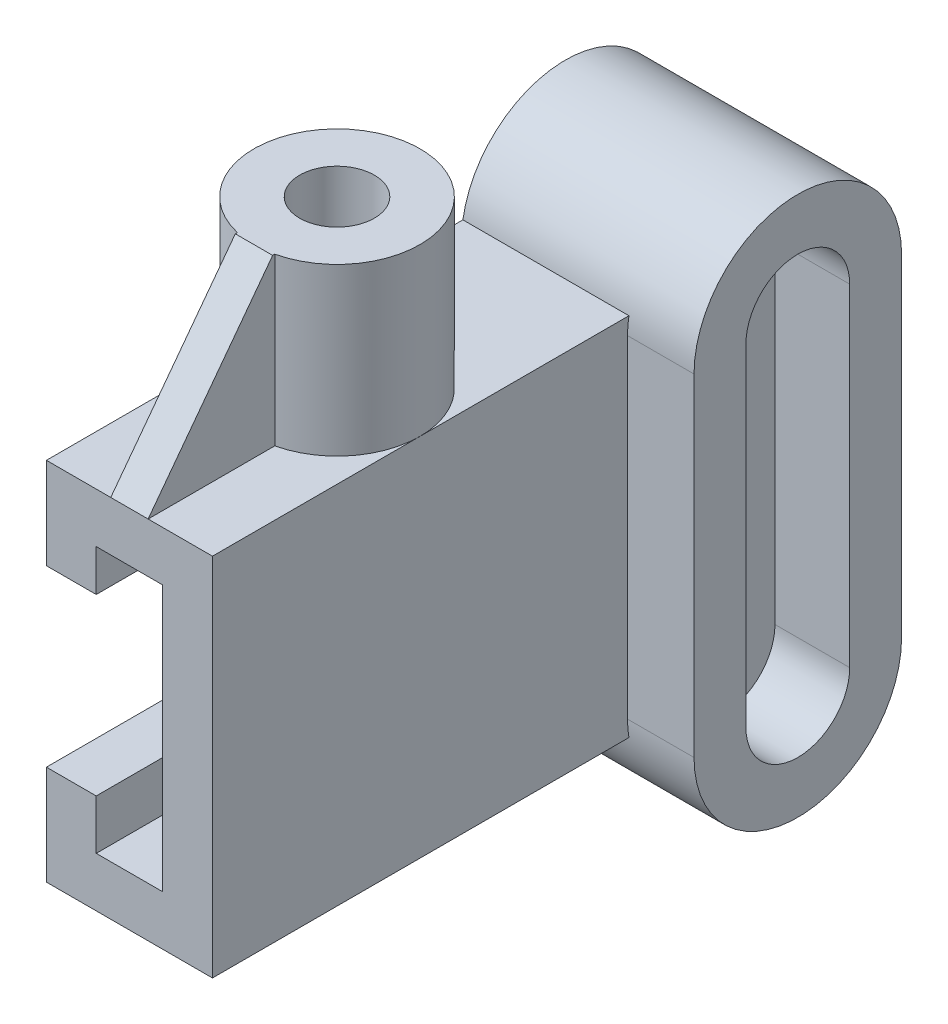
ISO-10303-21;
HEADER;
FILE_DESCRIPTION(('STEP AP214'),'2;1');
FILE_NAME('part.step','',(''),(''),'','','');
FILE_SCHEMA(('AUTOMOTIVE_DESIGN { 1 0 10303 214 1 1 1 1 }'));
ENDSEC;
DATA;
#1=APPLICATION_CONTEXT('core data for automotive mechanical design processes');
#2=APPLICATION_PROTOCOL_DEFINITION('international standard','automotive_design',2000,#1);
#3=PRODUCT_CONTEXT('',#1,'mechanical');
#4=PRODUCT('Part','Part','',(#3));
#5=PRODUCT_RELATED_PRODUCT_CATEGORY('part','',(#4));
#6=PRODUCT_DEFINITION_FORMATION('','',#4);
#7=PRODUCT_DEFINITION_CONTEXT('part definition',#1,'design');
#8=PRODUCT_DEFINITION('design','',#6,#7);
#9=PRODUCT_DEFINITION_SHAPE('','',#8);
#10=(LENGTH_UNIT() NAMED_UNIT(*) SI_UNIT(.MILLI.,.METRE.));
#11=(NAMED_UNIT(*) PLANE_ANGLE_UNIT() SI_UNIT($,.RADIAN.));
#12=(NAMED_UNIT(*) SI_UNIT($,.STERADIAN.) SOLID_ANGLE_UNIT());
#13=UNCERTAINTY_MEASURE_WITH_UNIT(LENGTH_MEASURE(1.E-05),#10,'distance_accuracy_value','');
#14=(GEOMETRIC_REPRESENTATION_CONTEXT(3) GLOBAL_UNCERTAINTY_ASSIGNED_CONTEXT((#13)) GLOBAL_UNIT_ASSIGNED_CONTEXT((#10,
#11,#12)) REPRESENTATION_CONTEXT('',''));
#15=CARTESIAN_POINT('',(0.,0.,0.));
#16=DIRECTION('',(0.,0.,1.));
#17=DIRECTION('',(1.,0.,0.));
#18=AXIS2_PLACEMENT_3D('',#15,#16,#17);
#19=CARTESIAN_POINT('',(0.,44.,125.));
#20=DIRECTION('',(0.,1.,0.));
#21=DIRECTION('',(-1.,0.,0.));
#22=AXIS2_PLACEMENT_3D('',#19,#20,#21);
#23=PLANE('',#22);
#24=DIRECTION('',(1.,0.,0.));
#25=VECTOR('',#24,1.);
#26=CARTESIAN_POINT('',(0.,44.,125.));
#27=LINE('',#26,#25);
#28=CARTESIAN_POINT('',(0.,44.,125.));
#29=VERTEX_POINT('',#28);
#30=CARTESIAN_POINT('',(15.5,44.,125.));
#31=VERTEX_POINT('',#30);
#32=EDGE_CURVE('E297',#29,#31,#27,.T.);
#33=ORIENTED_EDGE('',*,*,#32,.T.);
#34=DIRECTION('',(0.,0.,-1.));
#35=VECTOR('',#34,1.);
#36=CARTESIAN_POINT('',(15.5,44.,125.));
#37=LINE('',#36,#35);
#38=CARTESIAN_POINT('',(15.5,44.,94.4871752699051));
#39=VERTEX_POINT('',#38);
#40=EDGE_CURVE('E244',#31,#39,#37,.T.);
#41=ORIENTED_EDGE('',*,*,#40,.T.);
#42=CARTESIAN_POINT('',(20.,44.,75.));
#43=DIRECTION('',(0.,1.,0.));
#44=DIRECTION('',(-1.,0.,0.));
#45=AXIS2_PLACEMENT_3D('',#42,#43,#44);
#46=CIRCLE('',#45,20.);
#47=CARTESIAN_POINT('',(0.,44.,75.));
#48=VERTEX_POINT('',#47);
#49=EDGE_CURVE('E266',#48,#39,#46,.T.);
#50=ORIENTED_EDGE('',*,*,#49,.F.);
#51=DIRECTION('',(0.,0.,-1.));
#52=VECTOR('',#51,1.);
#53=CARTESIAN_POINT('',(0.,44.,125.));
#54=LINE('',#53,#52);
#55=EDGE_CURVE('E392',#29,#48,#54,.T.);
#56=ORIENTED_EDGE('',*,*,#55,.F.);
#57=EDGE_LOOP('',(#33,#41,#50,#56));
#58=FACE_BOUND('',#57,.T.);
#59=ADVANCED_FACE('F43',(#58),#23,.T.);
#60=DIRECTION('',(0.,0.,-1.));
#61=VECTOR('',#60,1.);
#62=CARTESIAN_POINT('',(40.,44.,125.));
#63=LINE('',#62,#61);
#64=CARTESIAN_POINT('',(40.,44.,75.));
#65=VERTEX_POINT('',#64);
#66=CARTESIAN_POINT('',(40.,44.,24.6779253585062));
#67=VERTEX_POINT('',#66);
#68=EDGE_CURVE('E391',#65,#67,#63,.T.);
#69=ORIENTED_EDGE('',*,*,#68,.T.);
#70=DIRECTION('',(-1.,0.,0.));
#71=VECTOR('',#70,1.);
#72=CARTESIAN_POINT('',(56.,44.,24.6779253585062));
#73=LINE('',#72,#71);
#74=CARTESIAN_POINT('',(0.,44.,24.6779253585062));
#75=VERTEX_POINT('',#74);
#76=EDGE_CURVE('E265',#75,#67,#73,.F.);
#77=ORIENTED_EDGE('',*,*,#76,.F.);
#78=EDGE_CURVE('E396',#48,#75,#54,.T.);
#79=ORIENTED_EDGE('',*,*,#78,.F.);
#80=CARTESIAN_POINT('',(20.,44.,75.));
#81=DIRECTION('',(0.,1.,0.));
#82=DIRECTION('',(-1.,0.,0.));
#83=AXIS2_PLACEMENT_3D('',#80,#81,#82);
#84=CIRCLE('',#83,20.);
#85=EDGE_CURVE('E11',#48,#65,#84,.F.);
#86=ORIENTED_EDGE('',*,*,#85,.T.);
#87=EDGE_LOOP('',(#69,#77,#79,#86));
#88=FACE_BOUND('',#87,.T.);
#89=ADVANCED_FACE('F568',(#88),#23,.T.);
#90=CARTESIAN_POINT('',(56.,-40.,25.));
#91=DIRECTION('',(0.,0.,-1.));
#92=DIRECTION('',(0.,1.,0.));
#93=AXIS2_PLACEMENT_3D('',#90,#91,#92);
#94=PLANE('',#93);
#95=DIRECTION('',(-1.,0.,0.));
#96=VECTOR('',#95,1.);
#97=CARTESIAN_POINT('',(56.,40.,25.));
#98=LINE('',#97,#96);
#99=CARTESIAN_POINT('',(56.,40.,25.));
#100=VERTEX_POINT('',#99);
#101=CARTESIAN_POINT('',(40.,40.,25.));
#102=VERTEX_POINT('',#101);
#103=EDGE_CURVE('E477',#100,#102,#98,.T.);
#104=ORIENTED_EDGE('',*,*,#103,.T.);
#105=DIRECTION('',(0.,-1.,0.));
#106=VECTOR('',#105,1.);
#107=CARTESIAN_POINT('',(40.,44.,25.));
#108=LINE('',#107,#106);
#109=CARTESIAN_POINT('',(40.,-40.,25.));
#110=VERTEX_POINT('',#109);
#111=EDGE_CURVE('E338',#102,#110,#108,.T.);
#112=ORIENTED_EDGE('',*,*,#111,.T.);
#113=DIRECTION('',(-1.,0.,0.));
#114=VECTOR('',#113,1.);
#115=CARTESIAN_POINT('',(56.,-40.,25.));
#116=LINE('',#115,#114);
#117=CARTESIAN_POINT('',(56.,-40.,25.));
#118=VERTEX_POINT('',#117);
#119=EDGE_CURVE('E459',#118,#110,#116,.T.);
#120=ORIENTED_EDGE('',*,*,#119,.F.);
#121=DIRECTION('',(0.,-1.,0.));
#122=VECTOR('',#121,1.);
#123=CARTESIAN_POINT('',(56.,-40.,25.));
#124=LINE('',#123,#122);
#125=EDGE_CURVE('E456',#100,#118,#124,.T.);
#126=ORIENTED_EDGE('',*,*,#125,.F.);
#127=EDGE_LOOP('',(#104,#112,#120,#126));
#128=FACE_BOUND('',#127,.T.);
#129=ADVANCED_FACE('F510',(#128),#94,.F.);
#130=CARTESIAN_POINT('',(56.,-40.,0.));
#131=DIRECTION('',(1.,0.,0.));
#132=DIRECTION('',(0.,0.,-1.));
#133=AXIS2_PLACEMENT_3D('',#130,#131,#132);
#134=PLANE('',#133);
#135=CARTESIAN_POINT('',(56.,-40.,0.));
#136=DIRECTION('',(1.,0.,0.));
#137=DIRECTION('',(0.,0.,-1.));
#138=AXIS2_PLACEMENT_3D('',#135,#136,#137);
#139=CIRCLE('',#138,25.);
#140=CARTESIAN_POINT('',(56.,-40.,-25.));
#141=VERTEX_POINT('',#140);
#142=EDGE_CURVE('E445',#118,#141,#139,.T.);
#143=ORIENTED_EDGE('',*,*,#142,.T.);
#144=DIRECTION('',(0.,1.,0.));
#145=VECTOR('',#144,1.);
#146=CARTESIAN_POINT('',(56.,-40.,-25.));
#147=LINE('',#146,#145);
#148=CARTESIAN_POINT('',(56.,40.,-25.));
#149=VERTEX_POINT('',#148);
#150=EDGE_CURVE('E449',#141,#149,#147,.T.);
#151=ORIENTED_EDGE('',*,*,#150,.T.);
#152=CARTESIAN_POINT('',(56.,40.,0.));
#153=DIRECTION('',(1.,0.,0.));
#154=DIRECTION('',(0.,0.,-1.));
#155=AXIS2_PLACEMENT_3D('',#152,#153,#154);
#156=CIRCLE('',#155,25.);
#157=EDGE_CURVE('E453',#149,#100,#156,.T.);
#158=ORIENTED_EDGE('',*,*,#157,.T.);
#159=ORIENTED_EDGE('',*,*,#125,.T.);
#160=EDGE_LOOP('',(#143,#151,#158,#159));
#161=FACE_BOUND('',#160,.T.);
#162=DIRECTION('',(0.,1.,0.));
#163=VECTOR('',#162,1.);
#164=CARTESIAN_POINT('',(56.,-40.,-12.5));
#165=LINE('',#164,#163);
#166=CARTESIAN_POINT('',(56.,-40.,-12.5));
#167=VERTEX_POINT('',#166);
#168=CARTESIAN_POINT('',(56.,40.,-12.5));
#169=VERTEX_POINT('',#168);
#170=EDGE_CURVE('E419',#167,#169,#165,.T.);
#171=ORIENTED_EDGE('',*,*,#170,.F.);
#172=CARTESIAN_POINT('',(56.,-40.,0.));
#173=DIRECTION('',(1.,0.,0.));
#174=DIRECTION('',(0.,0.,-1.));
#175=AXIS2_PLACEMENT_3D('',#172,#173,#174);
#176=CIRCLE('',#175,12.5);
#177=CARTESIAN_POINT('',(56.,-40.,12.5));
#178=VERTEX_POINT('',#177);
#179=EDGE_CURVE('E416',#178,#167,#176,.T.);
#180=ORIENTED_EDGE('',*,*,#179,.F.);
#181=DIRECTION('',(0.,-1.,0.));
#182=VECTOR('',#181,1.);
#183=CARTESIAN_POINT('',(56.,-40.,12.5));
#184=LINE('',#183,#182);
#185=CARTESIAN_POINT('',(56.,40.,12.5));
#186=VERTEX_POINT('',#185);
#187=EDGE_CURVE('E426',#186,#178,#184,.T.);
#188=ORIENTED_EDGE('',*,*,#187,.F.);
#189=CARTESIAN_POINT('',(56.,40.,0.));
#190=DIRECTION('',(1.,0.,0.));
#191=DIRECTION('',(0.,0.,-1.));
#192=AXIS2_PLACEMENT_3D('',#189,#190,#191);
#193=CIRCLE('',#192,12.5);
#194=EDGE_CURVE('E422',#169,#186,#193,.T.);
#195=ORIENTED_EDGE('',*,*,#194,.F.);
#196=EDGE_LOOP('',(#171,#180,#188,#195));
#197=FACE_BOUND('',#196,.T.);
#198=ADVANCED_FACE('F506',(#161,#197),#134,.T.);
#199=CARTESIAN_POINT('',(0.,-40.,0.));
#200=DIRECTION('',(1.,0.,0.));
#201=DIRECTION('',(0.,0.,-1.));
#202=AXIS2_PLACEMENT_3D('',#199,#200,#201);
#203=PLANE('',#202);
#204=CARTESIAN_POINT('',(0.,-40.,0.));
#205=DIRECTION('',(1.,0.,0.));
#206=DIRECTION('',(0.,0.,-1.));
#207=AXIS2_PLACEMENT_3D('',#204,#205,#206);
#208=CIRCLE('',#207,25.);
#209=CARTESIAN_POINT('',(0.,-44.,24.6779253585061));
#210=VERTEX_POINT('',#209);
#211=CARTESIAN_POINT('',(0.,-40.,-25.));
#212=VERTEX_POINT('',#211);
#213=EDGE_CURVE('E444',#210,#212,#208,.T.);
#214=ORIENTED_EDGE('',*,*,#213,.F.);
#215=DIRECTION('',(0.,0.,-1.));
#216=VECTOR('',#215,1.);
#217=CARTESIAN_POINT('',(0.,-44.,125.));
#218=LINE('',#217,#216);
#219=CARTESIAN_POINT('',(0.,-44.,125.));
#220=VERTEX_POINT('',#219);
#221=EDGE_CURVE('E380',#220,#210,#218,.T.);
#222=ORIENTED_EDGE('',*,*,#221,.F.);
#223=DIRECTION('',(0.,1.,0.));
#224=VECTOR('',#223,1.);
#225=CARTESIAN_POINT('',(0.,-44.,125.));
#226=LINE('',#225,#224);
#227=CARTESIAN_POINT('',(0.,-20.0156252354376,125.));
#228=VERTEX_POINT('',#227);
#229=EDGE_CURVE('E308',#220,#228,#226,.T.);
#230=ORIENTED_EDGE('',*,*,#229,.T.);
#231=DIRECTION('',(0.,0.,-1.));
#232=VECTOR('',#231,1.);
#233=CARTESIAN_POINT('',(0.,-20.0156252354376,125.));
#234=LINE('',#233,#232);
#235=CARTESIAN_POINT('',(0.,-20.0156252354376,25.));
#236=VERTEX_POINT('',#235);
#237=EDGE_CURVE('E377',#228,#236,#234,.T.);
#238=ORIENTED_EDGE('',*,*,#237,.T.);
#239=DIRECTION('',(0.,-1.,0.));
#240=VECTOR('',#239,1.);
#241=CARTESIAN_POINT('',(0.,-40.,25.));
#242=LINE('',#241,#240);
#243=CARTESIAN_POINT('',(0.,22.,25.));
#244=VERTEX_POINT('',#243);
#245=EDGE_CURVE('E450',#244,#236,#242,.T.);
#246=ORIENTED_EDGE('',*,*,#245,.F.);
#247=DIRECTION('',(0.,0.,-1.));
#248=VECTOR('',#247,1.);
#249=CARTESIAN_POINT('',(0.,22.,125.));
#250=LINE('',#249,#248);
#251=CARTESIAN_POINT('',(0.,22.,125.));
#252=VERTEX_POINT('',#251);
#253=EDGE_CURVE('E397',#252,#244,#250,.T.);
#254=ORIENTED_EDGE('',*,*,#253,.F.);
#255=DIRECTION('',(0.,1.,0.));
#256=VECTOR('',#255,1.);
#257=CARTESIAN_POINT('',(0.,22.,125.));
#258=LINE('',#257,#256);
#259=EDGE_CURVE('E292',#252,#29,#258,.T.);
#260=ORIENTED_EDGE('',*,*,#259,.T.);
#261=ORIENTED_EDGE('',*,*,#55,.T.);
#262=ORIENTED_EDGE('',*,*,#78,.T.);
#263=CARTESIAN_POINT('',(0.,40.,0.));
#264=DIRECTION('',(1.,0.,0.));
#265=DIRECTION('',(0.,0.,-1.));
#266=AXIS2_PLACEMENT_3D('',#263,#264,#265);
#267=CIRCLE('',#266,25.);
#268=CARTESIAN_POINT('',(0.,40.,-25.));
#269=VERTEX_POINT('',#268);
#270=EDGE_CURVE('E467',#269,#75,#267,.T.);
#271=ORIENTED_EDGE('',*,*,#270,.F.);
#272=DIRECTION('',(0.,1.,0.));
#273=VECTOR('',#272,1.);
#274=CARTESIAN_POINT('',(0.,-40.,-25.));
#275=LINE('',#274,#273);
#276=EDGE_CURVE('E463',#212,#269,#275,.T.);
#277=ORIENTED_EDGE('',*,*,#276,.F.);
#278=EDGE_LOOP('',(#214,#222,#230,#238,#246,#254,#260,#261,#262,#271,#277));
#279=FACE_BOUND('',#278,.T.);
#280=ADVANCED_FACE('F496',(#279),#203,.F.);
#281=CARTESIAN_POINT('',(56.,-40.,0.));
#282=DIRECTION('',(-1.,0.,0.));
#283=DIRECTION('',(0.,0.,1.));
#284=AXIS2_PLACEMENT_3D('',#281,#282,#283);
#285=CYLINDRICAL_SURFACE('',#284,25.);
#286=DIRECTION('',(-1.,0.,0.));
#287=VECTOR('',#286,1.);
#288=CARTESIAN_POINT('',(56.,-44.,24.6779253585061));
#289=LINE('',#288,#287);
#290=CARTESIAN_POINT('',(40.,-44.,24.6779253585061));
#291=VERTEX_POINT('',#290);
#292=EDGE_CURVE('E276',#291,#210,#289,.T.);
#293=ORIENTED_EDGE('',*,*,#292,.T.);
#294=ORIENTED_EDGE('',*,*,#213,.T.);
#295=DIRECTION('',(-1.,0.,0.));
#296=VECTOR('',#295,1.);
#297=CARTESIAN_POINT('',(56.,-40.,-25.));
#298=LINE('',#297,#296);
#299=EDGE_CURVE('E52',#141,#212,#298,.T.);
#300=ORIENTED_EDGE('',*,*,#299,.F.);
#301=ORIENTED_EDGE('',*,*,#142,.F.);
#302=ORIENTED_EDGE('',*,*,#119,.T.);
#303=CARTESIAN_POINT('',(40.,-40.,0.));
#304=DIRECTION('',(-1.,0.,0.));
#305=DIRECTION('',(0.,0.,1.));
#306=AXIS2_PLACEMENT_3D('',#303,#304,#305);
#307=CIRCLE('',#306,25.);
#308=EDGE_CURVE('E273',#110,#291,#307,.F.);
#309=ORIENTED_EDGE('',*,*,#308,.T.);
#310=EDGE_LOOP('',(#293,#294,#300,#301,#302,#309));
#311=FACE_BOUND('',#310,.T.);
#312=ADVANCED_FACE('F45',(#311),#285,.T.);
#313=CARTESIAN_POINT('',(56.,-40.,-25.));
#314=DIRECTION('',(0.,0.,1.));
#315=DIRECTION('',(0.,-1.,0.));
#316=AXIS2_PLACEMENT_3D('',#313,#314,#315);
#317=PLANE('',#316);
#318=ORIENTED_EDGE('',*,*,#299,.T.);
#319=ORIENTED_EDGE('',*,*,#276,.T.);
#320=DIRECTION('',(-1.,0.,0.));
#321=VECTOR('',#320,1.);
#322=CARTESIAN_POINT('',(56.,40.,-25.));
#323=LINE('',#322,#321);
#324=EDGE_CURVE('E481',#149,#269,#323,.T.);
#325=ORIENTED_EDGE('',*,*,#324,.F.);
#326=ORIENTED_EDGE('',*,*,#150,.F.);
#327=EDGE_LOOP('',(#318,#319,#325,#326));
#328=FACE_BOUND('',#327,.T.);
#329=ADVANCED_FACE('F486',(#328),#317,.F.);
#330=CARTESIAN_POINT('',(56.,40.,0.));
#331=DIRECTION('',(-1.,0.,0.));
#332=DIRECTION('',(0.,0.,1.));
#333=AXIS2_PLACEMENT_3D('',#330,#331,#332);
#334=CYLINDRICAL_SURFACE('',#333,25.);
#335=ORIENTED_EDGE('',*,*,#324,.T.);
#336=ORIENTED_EDGE('',*,*,#270,.T.);
#337=ORIENTED_EDGE('',*,*,#76,.T.);
#338=CARTESIAN_POINT('',(40.,40.,0.));
#339=DIRECTION('',(-1.,0.,0.));
#340=DIRECTION('',(0.,0.,1.));
#341=AXIS2_PLACEMENT_3D('',#338,#339,#340);
#342=CIRCLE('',#341,25.);
#343=EDGE_CURVE('E269',#67,#102,#342,.F.);
#344=ORIENTED_EDGE('',*,*,#343,.T.);
#345=ORIENTED_EDGE('',*,*,#103,.F.);
#346=ORIENTED_EDGE('',*,*,#157,.F.);
#347=EDGE_LOOP('',(#335,#336,#337,#344,#345,#346));
#348=FACE_BOUND('',#347,.T.);
#349=ADVANCED_FACE('F500',(#348),#334,.T.);
#350=DIRECTION('',(-1.,0.,0.));
#351=VECTOR('',#350,1.);
#352=CARTESIAN_POINT('',(28.,32.,25.));
#353=LINE('',#352,#351);
#354=CARTESIAN_POINT('',(28.,32.,25.));
#355=VERTEX_POINT('',#354);
#356=CARTESIAN_POINT('',(12.,32.,25.));
#357=VERTEX_POINT('',#356);
#358=EDGE_CURVE('E288',#355,#357,#353,.T.);
#359=ORIENTED_EDGE('',*,*,#358,.T.);
#360=DIRECTION('',(0.,-1.,0.));
#361=VECTOR('',#360,1.);
#362=CARTESIAN_POINT('',(12.,32.,25.));
#363=LINE('',#362,#361);
#364=CARTESIAN_POINT('',(12.,22.,25.));
#365=VERTEX_POINT('',#364);
#366=EDGE_CURVE('E279',#357,#365,#363,.T.);
#367=ORIENTED_EDGE('',*,*,#366,.T.);
#368=DIRECTION('',(-1.,0.,0.));
#369=VECTOR('',#368,1.);
#370=CARTESIAN_POINT('',(12.,22.,25.));
#371=LINE('',#370,#369);
#372=EDGE_CURVE('E334',#365,#244,#371,.T.);
#373=ORIENTED_EDGE('',*,*,#372,.T.);
#374=ORIENTED_EDGE('',*,*,#245,.T.);
#375=DIRECTION('',(1.,0.,0.));
#376=VECTOR('',#375,1.);
#377=CARTESIAN_POINT('',(0.,-20.0156252354376,25.));
#378=LINE('',#377,#376);
#379=CARTESIAN_POINT('',(12.,-20.0156252354376,25.));
#380=VERTEX_POINT('',#379);
#381=EDGE_CURVE('E342',#236,#380,#378,.T.);
#382=ORIENTED_EDGE('',*,*,#381,.T.);
#383=DIRECTION('',(0.,-1.,0.));
#384=VECTOR('',#383,1.);
#385=CARTESIAN_POINT('',(12.,-20.0156252354376,25.));
#386=LINE('',#385,#384);
#387=CARTESIAN_POINT('',(12.,-32.,25.));
#388=VERTEX_POINT('',#387);
#389=EDGE_CURVE('E346',#380,#388,#386,.T.);
#390=ORIENTED_EDGE('',*,*,#389,.T.);
#391=DIRECTION('',(1.,0.,0.));
#392=VECTOR('',#391,1.);
#393=CARTESIAN_POINT('',(12.,-32.,25.));
#394=LINE('',#393,#392);
#395=CARTESIAN_POINT('',(28.,-32.,25.));
#396=VERTEX_POINT('',#395);
#397=EDGE_CURVE('E350',#388,#396,#394,.T.);
#398=ORIENTED_EDGE('',*,*,#397,.T.);
#399=DIRECTION('',(0.,1.,0.));
#400=VECTOR('',#399,1.);
#401=CARTESIAN_POINT('',(28.,-32.,25.));
#402=LINE('',#401,#400);
#403=EDGE_CURVE('E353',#396,#355,#402,.T.);
#404=ORIENTED_EDGE('',*,*,#403,.T.);
#405=EDGE_LOOP('',(#359,#367,#373,#374,#382,#390,#398,#404));
#406=FACE_BOUND('',#405,.T.);
#407=ADVANCED_FACE('F534',(#406),#94,.F.);
#408=CARTESIAN_POINT('',(56.,-40.,0.));
#409=DIRECTION('',(-1.,0.,0.));
#410=DIRECTION('',(0.,0.,1.));
#411=AXIS2_PLACEMENT_3D('',#408,#409,#410);
#412=CYLINDRICAL_SURFACE('',#411,12.5);
#413=CARTESIAN_POINT('',(38.,-40.,0.));
#414=DIRECTION('',(1.,0.,0.));
#415=DIRECTION('',(0.,0.,-1.));
#416=AXIS2_PLACEMENT_3D('',#413,#414,#415);
#417=CIRCLE('',#416,12.5);
#418=CARTESIAN_POINT('',(38.,-40.,12.5));
#419=VERTEX_POINT('',#418);
#420=CARTESIAN_POINT('',(38.,-40.,-12.5));
#421=VERTEX_POINT('',#420);
#422=EDGE_CURVE('E412',#419,#421,#417,.T.);
#423=ORIENTED_EDGE('',*,*,#422,.F.);
#424=DIRECTION('',(-1.,0.,0.));
#425=VECTOR('',#424,1.);
#426=CARTESIAN_POINT('',(56.,-40.,12.5));
#427=LINE('',#426,#425);
#428=EDGE_CURVE('E429',#178,#419,#427,.T.);
#429=ORIENTED_EDGE('',*,*,#428,.F.);
#430=ORIENTED_EDGE('',*,*,#179,.T.);
#431=DIRECTION('',(-1.,0.,0.));
#432=VECTOR('',#431,1.);
#433=CARTESIAN_POINT('',(56.,-40.,-12.5));
#434=LINE('',#433,#432);
#435=EDGE_CURVE('E440',#167,#421,#434,.T.);
#436=ORIENTED_EDGE('',*,*,#435,.T.);
#437=EDGE_LOOP('',(#423,#429,#430,#436));
#438=FACE_BOUND('',#437,.T.);
#439=ADVANCED_FACE('F824',(#438),#412,.F.);
#440=CARTESIAN_POINT('',(56.,-40.,-12.5));
#441=DIRECTION('',(0.,0.,1.));
#442=DIRECTION('',(0.,-1.,0.));
#443=AXIS2_PLACEMENT_3D('',#440,#441,#442);
#444=PLANE('',#443);
#445=DIRECTION('',(0.,1.,0.));
#446=VECTOR('',#445,1.);
#447=CARTESIAN_POINT('',(38.,0.,-12.5));
#448=LINE('',#447,#446);
#449=CARTESIAN_POINT('',(38.,40.,-12.5));
#450=VERTEX_POINT('',#449);
#451=EDGE_CURVE('E363',#421,#450,#448,.T.);
#452=ORIENTED_EDGE('',*,*,#451,.F.);
#453=ORIENTED_EDGE('',*,*,#435,.F.);
#454=ORIENTED_EDGE('',*,*,#170,.T.);
#455=DIRECTION('',(-1.,0.,0.));
#456=VECTOR('',#455,1.);
#457=CARTESIAN_POINT('',(56.,40.,-12.5));
#458=LINE('',#457,#456);
#459=EDGE_CURVE('E436',#169,#450,#458,.T.);
#460=ORIENTED_EDGE('',*,*,#459,.T.);
#461=EDGE_LOOP('',(#452,#453,#454,#460));
#462=FACE_BOUND('',#461,.T.);
#463=ADVANCED_FACE('F814',(#462),#444,.T.);
#464=CARTESIAN_POINT('',(56.,40.,0.));
#465=DIRECTION('',(-1.,0.,0.));
#466=DIRECTION('',(0.,0.,1.));
#467=AXIS2_PLACEMENT_3D('',#464,#465,#466);
#468=CYLINDRICAL_SURFACE('',#467,12.5);
#469=CARTESIAN_POINT('',(38.,40.,0.));
#470=DIRECTION('',(1.,0.,0.));
#471=DIRECTION('',(0.,0.,-1.));
#472=AXIS2_PLACEMENT_3D('',#469,#470,#471);
#473=CIRCLE('',#472,12.5);
#474=CARTESIAN_POINT('',(38.,40.,12.5));
#475=VERTEX_POINT('',#474);
#476=EDGE_CURVE('E405',#450,#475,#473,.T.);
#477=ORIENTED_EDGE('',*,*,#476,.F.);
#478=ORIENTED_EDGE('',*,*,#459,.F.);
#479=ORIENTED_EDGE('',*,*,#194,.T.);
#480=DIRECTION('',(-1.,0.,0.));
#481=VECTOR('',#480,1.);
#482=CARTESIAN_POINT('',(56.,40.,12.5));
#483=LINE('',#482,#481);
#484=EDGE_CURVE('E432',#186,#475,#483,.T.);
#485=ORIENTED_EDGE('',*,*,#484,.T.);
#486=EDGE_LOOP('',(#477,#478,#479,#485));
#487=FACE_BOUND('',#486,.T.);
#488=ADVANCED_FACE('F804',(#487),#468,.F.);
#489=CARTESIAN_POINT('',(56.,-40.,12.5));
#490=DIRECTION('',(0.,0.,-1.));
#491=DIRECTION('',(0.,1.,0.));
#492=AXIS2_PLACEMENT_3D('',#489,#490,#491);
#493=PLANE('',#492);
#494=DIRECTION('',(0.,1.,0.));
#495=VECTOR('',#494,1.);
#496=CARTESIAN_POINT('',(38.,0.,12.5));
#497=LINE('',#496,#495);
#498=EDGE_CURVE('E409',#419,#475,#497,.T.);
#499=ORIENTED_EDGE('',*,*,#498,.T.);
#500=ORIENTED_EDGE('',*,*,#484,.F.);
#501=ORIENTED_EDGE('',*,*,#187,.T.);
#502=ORIENTED_EDGE('',*,*,#428,.T.);
#503=EDGE_LOOP('',(#499,#500,#501,#502));
#504=FACE_BOUND('',#503,.T.);
#505=ADVANCED_FACE('F794',(#504),#493,.T.);
#506=CARTESIAN_POINT('',(38.,0.,0.));
#507=DIRECTION('',(1.,0.,0.));
#508=DIRECTION('',(0.,0.,-1.));
#509=AXIS2_PLACEMENT_3D('',#506,#507,#508);
#510=PLANE('',#509);
#511=ORIENTED_EDGE('',*,*,#451,.T.);
#512=ORIENTED_EDGE('',*,*,#476,.T.);
#513=ORIENTED_EDGE('',*,*,#498,.F.);
#514=ORIENTED_EDGE('',*,*,#422,.T.);
#515=EDGE_LOOP('',(#511,#512,#513,#514));
#516=FACE_BOUND('',#515,.T.);
#517=ADVANCED_FACE('F774',(#516),#510,.T.);
#518=CARTESIAN_POINT('',(12.,32.,125.));
#519=DIRECTION('',(1.,0.,0.));
#520=DIRECTION('',(0.,1.,0.));
#521=AXIS2_PLACEMENT_3D('',#518,#519,#520);
#522=PLANE('',#521);
#523=ORIENTED_EDGE('',*,*,#366,.F.);
#524=DIRECTION('',(0.,0.,-1.));
#525=VECTOR('',#524,1.);
#526=CARTESIAN_POINT('',(12.,32.,125.));
#527=LINE('',#526,#525);
#528=CARTESIAN_POINT('',(12.,32.,125.));
#529=VERTEX_POINT('',#528);
#530=EDGE_CURVE('E359',#529,#357,#527,.T.);
#531=ORIENTED_EDGE('',*,*,#530,.F.);
#532=DIRECTION('',(0.,-1.,0.));
#533=VECTOR('',#532,1.);
#534=CARTESIAN_POINT('',(12.,32.,125.));
#535=LINE('',#534,#533);
#536=CARTESIAN_POINT('',(12.,22.,125.));
#537=VERTEX_POINT('',#536);
#538=EDGE_CURVE('E283',#529,#537,#535,.T.);
#539=ORIENTED_EDGE('',*,*,#538,.T.);
#540=DIRECTION('',(0.,0.,-1.));
#541=VECTOR('',#540,1.);
#542=CARTESIAN_POINT('',(12.,22.,125.));
#543=LINE('',#542,#541);
#544=EDGE_CURVE('E330',#537,#365,#543,.T.);
#545=ORIENTED_EDGE('',*,*,#544,.T.);
#546=EDGE_LOOP('',(#523,#531,#539,#545));
#547=FACE_BOUND('',#546,.T.);
#548=ADVANCED_FACE('F545',(#547),#522,.T.);
#549=CARTESIAN_POINT('',(28.,32.,125.));
#550=DIRECTION('',(0.,-1.,0.));
#551=DIRECTION('',(0.,0.,-1.));
#552=AXIS2_PLACEMENT_3D('',#549,#550,#551);
#553=PLANE('',#552);
#554=DIRECTION('',(-1.,0.,0.));
#555=VECTOR('',#554,1.);
#556=CARTESIAN_POINT('',(28.,32.,125.));
#557=LINE('',#556,#555);
#558=CARTESIAN_POINT('',(28.,32.,125.));
#559=VERTEX_POINT('',#558);
#560=EDGE_CURVE('E327',#559,#529,#557,.T.);
#561=ORIENTED_EDGE('',*,*,#560,.T.);
#562=ORIENTED_EDGE('',*,*,#530,.T.);
#563=ORIENTED_EDGE('',*,*,#358,.F.);
#564=DIRECTION('',(0.,0.,-1.));
#565=VECTOR('',#564,1.);
#566=CARTESIAN_POINT('',(28.,32.,125.));
#567=LINE('',#566,#565);
#568=EDGE_CURVE('E364',#559,#355,#567,.T.);
#569=ORIENTED_EDGE('',*,*,#568,.F.);
#570=EDGE_LOOP('',(#561,#562,#563,#569));
#571=FACE_BOUND('',#570,.T.);
#572=ADVANCED_FACE('F548',(#571),#553,.T.);
#573=CARTESIAN_POINT('',(28.,-32.,125.));
#574=DIRECTION('',(-1.,0.,0.));
#575=DIRECTION('',(0.,0.,1.));
#576=AXIS2_PLACEMENT_3D('',#573,#574,#575);
#577=PLANE('',#576);
#578=ORIENTED_EDGE('',*,*,#403,.F.);
#579=DIRECTION('',(0.,0.,-1.));
#580=VECTOR('',#579,1.);
#581=CARTESIAN_POINT('',(28.,-32.,125.));
#582=LINE('',#581,#580);
#583=CARTESIAN_POINT('',(28.,-32.,125.));
#584=VERTEX_POINT('',#583);
#585=EDGE_CURVE('E367',#584,#396,#582,.T.);
#586=ORIENTED_EDGE('',*,*,#585,.F.);
#587=DIRECTION('',(0.,1.,0.));
#588=VECTOR('',#587,1.);
#589=CARTESIAN_POINT('',(28.,-32.,125.));
#590=LINE('',#589,#588);
#591=EDGE_CURVE('E323',#584,#559,#590,.T.);
#592=ORIENTED_EDGE('',*,*,#591,.T.);
#593=ORIENTED_EDGE('',*,*,#568,.T.);
#594=EDGE_LOOP('',(#578,#586,#592,#593));
#595=FACE_BOUND('',#594,.T.);
#596=ADVANCED_FACE('F553',(#595),#577,.T.);
#597=CARTESIAN_POINT('',(12.,-32.,125.));
#598=DIRECTION('',(0.,1.,0.));
#599=DIRECTION('',(0.,0.,1.));
#600=AXIS2_PLACEMENT_3D('',#597,#598,#599);
#601=PLANE('',#600);
#602=ORIENTED_EDGE('',*,*,#585,.T.);
#603=ORIENTED_EDGE('',*,*,#397,.F.);
#604=DIRECTION('',(0.,0.,-1.));
#605=VECTOR('',#604,1.);
#606=CARTESIAN_POINT('',(12.,-32.,125.));
#607=LINE('',#606,#605);
#608=CARTESIAN_POINT('',(12.,-32.,125.));
#609=VERTEX_POINT('',#608);
#610=EDGE_CURVE('E371',#609,#388,#607,.T.);
#611=ORIENTED_EDGE('',*,*,#610,.F.);
#612=DIRECTION('',(1.,0.,0.));
#613=VECTOR('',#612,1.);
#614=CARTESIAN_POINT('',(12.,-32.,125.));
#615=LINE('',#614,#613);
#616=EDGE_CURVE('E320',#609,#584,#615,.T.);
#617=ORIENTED_EDGE('',*,*,#616,.T.);
#618=EDGE_LOOP('',(#602,#603,#611,#617));
#619=FACE_BOUND('',#618,.T.);
#620=ADVANCED_FACE('F556',(#619),#601,.T.);
#621=CARTESIAN_POINT('',(12.,-20.0156252354376,125.));
#622=DIRECTION('',(1.,0.,0.));
#623=DIRECTION('',(0.,1.,0.));
#624=AXIS2_PLACEMENT_3D('',#621,#622,#623);
#625=PLANE('',#624);
#626=ORIENTED_EDGE('',*,*,#389,.F.);
#627=DIRECTION('',(0.,0.,-1.));
#628=VECTOR('',#627,1.);
#629=CARTESIAN_POINT('',(12.,-20.0156252354376,125.));
#630=LINE('',#629,#628);
#631=CARTESIAN_POINT('',(12.,-20.0156252354376,125.));
#632=VERTEX_POINT('',#631);
#633=EDGE_CURVE('E374',#632,#380,#630,.T.);
#634=ORIENTED_EDGE('',*,*,#633,.F.);
#635=DIRECTION('',(0.,-1.,0.));
#636=VECTOR('',#635,1.);
#637=CARTESIAN_POINT('',(12.,-20.0156252354376,125.));
#638=LINE('',#637,#636);
#639=EDGE_CURVE('E316',#632,#609,#638,.T.);
#640=ORIENTED_EDGE('',*,*,#639,.T.);
#641=ORIENTED_EDGE('',*,*,#610,.T.);
#642=EDGE_LOOP('',(#626,#634,#640,#641));
#643=FACE_BOUND('',#642,.T.);
#644=ADVANCED_FACE('F558',(#643),#625,.T.);
#645=CARTESIAN_POINT('',(0.,-20.0156252354376,125.));
#646=DIRECTION('',(0.,1.,0.));
#647=DIRECTION('',(0.,0.,1.));
#648=AXIS2_PLACEMENT_3D('',#645,#646,#647);
#649=PLANE('',#648);
#650=ORIENTED_EDGE('',*,*,#381,.F.);
#651=ORIENTED_EDGE('',*,*,#237,.F.);
#652=DIRECTION('',(1.,0.,0.));
#653=VECTOR('',#652,1.);
#654=CARTESIAN_POINT('',(0.,-20.0156252354376,125.));
#655=LINE('',#654,#653);
#656=EDGE_CURVE('E312',#228,#632,#655,.T.);
#657=ORIENTED_EDGE('',*,*,#656,.T.);
#658=ORIENTED_EDGE('',*,*,#633,.T.);
#659=EDGE_LOOP('',(#650,#651,#657,#658));
#660=FACE_BOUND('',#659,.T.);
#661=ADVANCED_FACE('F529',(#660),#649,.T.);
#662=CARTESIAN_POINT('',(40.,-44.,125.));
#663=DIRECTION('',(0.,-1.,0.));
#664=DIRECTION('',(1.,0.,0.));
#665=AXIS2_PLACEMENT_3D('',#662,#663,#664);
#666=PLANE('',#665);
#667=DIRECTION('',(-1.,0.,0.));
#668=VECTOR('',#667,1.);
#669=CARTESIAN_POINT('',(40.,-44.,125.));
#670=LINE('',#669,#668);
#671=CARTESIAN_POINT('',(40.,-44.,125.));
#672=VERTEX_POINT('',#671);
#673=EDGE_CURVE('E305',#672,#220,#670,.T.);
#674=ORIENTED_EDGE('',*,*,#673,.T.);
#675=ORIENTED_EDGE('',*,*,#221,.T.);
#676=ORIENTED_EDGE('',*,*,#292,.F.);
#677=DIRECTION('',(0.,0.,-1.));
#678=VECTOR('',#677,1.);
#679=CARTESIAN_POINT('',(40.,-44.,125.));
#680=LINE('',#679,#678);
#681=EDGE_CURVE('E384',#672,#291,#680,.T.);
#682=ORIENTED_EDGE('',*,*,#681,.F.);
#683=EDGE_LOOP('',(#674,#675,#676,#682));
#684=FACE_BOUND('',#683,.T.);
#685=ADVANCED_FACE('F519',(#684),#666,.T.);
#686=CARTESIAN_POINT('',(40.,44.,125.));
#687=DIRECTION('',(1.,0.,0.));
#688=DIRECTION('',(0.,0.,-1.));
#689=AXIS2_PLACEMENT_3D('',#686,#687,#688);
#690=PLANE('',#689);
#691=ORIENTED_EDGE('',*,*,#111,.F.);
#692=ORIENTED_EDGE('',*,*,#343,.F.);
#693=ORIENTED_EDGE('',*,*,#68,.F.);
#694=CARTESIAN_POINT('',(40.,44.,125.));
#695=VERTEX_POINT('',#694);
#696=EDGE_CURVE('E387',#695,#65,#63,.T.);
#697=ORIENTED_EDGE('',*,*,#696,.F.);
#698=DIRECTION('',(0.,-1.,0.));
#699=VECTOR('',#698,1.);
#700=CARTESIAN_POINT('',(40.,44.,125.));
#701=LINE('',#700,#699);
#702=EDGE_CURVE('E301',#695,#672,#701,.T.);
#703=ORIENTED_EDGE('',*,*,#702,.T.);
#704=ORIENTED_EDGE('',*,*,#681,.T.);
#705=ORIENTED_EDGE('',*,*,#308,.F.);
#706=EDGE_LOOP('',(#691,#692,#693,#697,#703,#704,#705));
#707=FACE_BOUND('',#706,.T.);
#708=ADVANCED_FACE('F513',(#707),#690,.T.);
#709=DIRECTION('',(0.,0.,-1.));
#710=VECTOR('',#709,1.);
#711=CARTESIAN_POINT('',(24.5,44.,125.));
#712=LINE('',#711,#710);
#713=CARTESIAN_POINT('',(24.5,44.,125.));
#714=VERTEX_POINT('',#713);
#715=CARTESIAN_POINT('',(24.5,44.,94.4871752699051));
#716=VERTEX_POINT('',#715);
#717=EDGE_CURVE('E251',#714,#716,#712,.T.);
#718=ORIENTED_EDGE('',*,*,#717,.F.);
#719=EDGE_CURVE('E296',#714,#695,#27,.T.);
#720=ORIENTED_EDGE('',*,*,#719,.T.);
#721=ORIENTED_EDGE('',*,*,#696,.T.);
#722=EDGE_CURVE('E261',#716,#65,#46,.T.);
#723=ORIENTED_EDGE('',*,*,#722,.F.);
#724=EDGE_LOOP('',(#718,#720,#721,#723));
#725=FACE_BOUND('',#724,.T.);
#726=ADVANCED_FACE('F571',(#725),#23,.T.);
#727=CARTESIAN_POINT('',(12.,22.,125.));
#728=DIRECTION('',(0.,-1.,0.));
#729=DIRECTION('',(1.,0.,0.));
#730=AXIS2_PLACEMENT_3D('',#727,#728,#729);
#731=PLANE('',#730);
#732=ORIENTED_EDGE('',*,*,#372,.F.);
#733=ORIENTED_EDGE('',*,*,#544,.F.);
#734=DIRECTION('',(-1.,0.,0.));
#735=VECTOR('',#734,1.);
#736=CARTESIAN_POINT('',(12.,22.,125.));
#737=LINE('',#736,#735);
#738=EDGE_CURVE('E287',#537,#252,#737,.T.);
#739=ORIENTED_EDGE('',*,*,#738,.T.);
#740=ORIENTED_EDGE('',*,*,#253,.T.);
#741=EDGE_LOOP('',(#732,#733,#739,#740));
#742=FACE_BOUND('',#741,.T.);
#743=ADVANCED_FACE('F538',(#742),#731,.T.);
#744=CARTESIAN_POINT('',(0.,0.,125.));
#745=DIRECTION('',(0.,0.,-1.));
#746=DIRECTION('',(-1.,0.,0.));
#747=AXIS2_PLACEMENT_3D('',#744,#745,#746);
#748=PLANE('',#747);
#749=ORIENTED_EDGE('',*,*,#719,.F.);
#750=DIRECTION('',(-1.,0.,0.));
#751=VECTOR('',#750,1.);
#752=CARTESIAN_POINT('',(0.,44.,125.));
#753=LINE('',#752,#751);
#754=EDGE_CURVE('E258',#31,#714,#753,.F.);
#755=ORIENTED_EDGE('',*,*,#754,.F.);
#756=ORIENTED_EDGE('',*,*,#32,.F.);
#757=ORIENTED_EDGE('',*,*,#259,.F.);
#758=ORIENTED_EDGE('',*,*,#738,.F.);
#759=ORIENTED_EDGE('',*,*,#538,.F.);
#760=ORIENTED_EDGE('',*,*,#560,.F.);
#761=ORIENTED_EDGE('',*,*,#591,.F.);
#762=ORIENTED_EDGE('',*,*,#616,.F.);
#763=ORIENTED_EDGE('',*,*,#639,.F.);
#764=ORIENTED_EDGE('',*,*,#656,.F.);
#765=ORIENTED_EDGE('',*,*,#229,.F.);
#766=ORIENTED_EDGE('',*,*,#673,.F.);
#767=ORIENTED_EDGE('',*,*,#702,.F.);
#768=EDGE_LOOP('',(#749,#755,#756,#757,#758,#759,#760,#761,#762,#763,#764,#765,#766,#767));
#769=FACE_BOUND('',#768,.T.);
#770=ADVANCED_FACE('F524',(#769),#748,.F.);
#771=CARTESIAN_POINT('',(20.,84.,75.));
#772=DIRECTION('',(0.,-1.,0.));
#773=DIRECTION('',(1.,0.,0.));
#774=AXIS2_PLACEMENT_3D('',#771,#772,#773);
#775=CYLINDRICAL_SURFACE('',#774,20.);
#776=CARTESIAN_POINT('',(20.,84.,75.));
#777=DIRECTION('',(0.,1.,0.));
#778=DIRECTION('',(-1.,0.,0.));
#779=AXIS2_PLACEMENT_3D('',#776,#777,#778);
#780=CIRCLE('',#779,20.);
#781=CARTESIAN_POINT('',(24.5,84.,94.4871752699051));
#782=VERTEX_POINT('',#781);
#783=CARTESIAN_POINT('',(15.5,84.,94.4871752699051));
#784=VERTEX_POINT('',#783);
#785=EDGE_CURVE('E262',#782,#784,#780,.T.);
#786=ORIENTED_EDGE('',*,*,#785,.F.);
#787=DIRECTION('',(0.,-1.,0.));
#788=VECTOR('',#787,1.);
#789=CARTESIAN_POINT('',(24.5,84.,94.4871752699051));
#790=LINE('',#789,#788);
#791=EDGE_CURVE('E254',#782,#716,#790,.T.);
#792=ORIENTED_EDGE('',*,*,#791,.T.);
#793=ORIENTED_EDGE('',*,*,#722,.T.);
#794=ORIENTED_EDGE('',*,*,#85,.F.);
#795=ORIENTED_EDGE('',*,*,#49,.T.);
#796=DIRECTION('',(0.,-1.,0.));
#797=VECTOR('',#796,1.);
#798=CARTESIAN_POINT('',(15.5,84.,94.4871752699051));
#799=LINE('',#798,#797);
#800=EDGE_CURVE('E248',#784,#39,#799,.T.);
#801=ORIENTED_EDGE('',*,*,#800,.F.);
#802=EDGE_LOOP('',(#786,#792,#793,#794,#795,#801));
#803=FACE_BOUND('',#802,.T.);
#804=ADVANCED_FACE('F592',(#803),#775,.T.);
#805=CARTESIAN_POINT('',(20.,84.,75.));
#806=DIRECTION('',(0.,1.,0.));
#807=DIRECTION('',(-1.,0.,0.));
#808=AXIS2_PLACEMENT_3D('',#805,#806,#807);
#809=PLANE('',#808);
#810=CARTESIAN_POINT('',(20.,84.,75.));
#811=DIRECTION('',(0.,1.,0.));
#812=DIRECTION('',(0.,0.,1.));
#813=AXIS2_PLACEMENT_3D('',#810,#811,#812);
#814=CIRCLE('',#813,8.99999999999999);
#815=CARTESIAN_POINT('',(20.,84.,84.));
#816=VERTEX_POINT('',#815);
#817=EDGE_CURVE('E223',#816,#816,#814,.T.);
#818=ORIENTED_EDGE('',*,*,#817,.F.);
#819=EDGE_LOOP('',(#818));
#820=FACE_BOUND('',#819,.T.);
#821=ORIENTED_EDGE('',*,*,#785,.T.);
#822=DIRECTION('',(0.,0.,-1.));
#823=VECTOR('',#822,1.);
#824=CARTESIAN_POINT('',(15.5,84.,50.));
#825=LINE('',#824,#823);
#826=CARTESIAN_POINT('',(15.5,84.,95.));
#827=VERTEX_POINT('',#826);
#828=EDGE_CURVE('E222',#827,#784,#825,.T.);
#829=ORIENTED_EDGE('',*,*,#828,.F.);
#830=DIRECTION('',(1.,0.,0.));
#831=VECTOR('',#830,1.);
#832=CARTESIAN_POINT('',(20.,84.,95.));
#833=LINE('',#832,#831);
#834=CARTESIAN_POINT('',(24.5,84.,95.));
#835=VERTEX_POINT('',#834);
#836=EDGE_CURVE('E237',#827,#835,#833,.T.);
#837=ORIENTED_EDGE('',*,*,#836,.T.);
#838=DIRECTION('',(0.,0.,-1.));
#839=VECTOR('',#838,1.);
#840=CARTESIAN_POINT('',(24.5,84.,50.));
#841=LINE('',#840,#839);
#842=EDGE_CURVE('E59',#835,#782,#841,.T.);
#843=ORIENTED_EDGE('',*,*,#842,.T.);
#844=EDGE_LOOP('',(#821,#829,#837,#843));
#845=FACE_BOUND('',#844,.T.);
#846=ADVANCED_FACE('F601',(#820,#845),#809,.T.);
#847=CARTESIAN_POINT('',(24.5,9.49999999999999,50.));
#848=DIRECTION('',(1.,0.,0.));
#849=DIRECTION('',(0.,0.,-1.));
#850=AXIS2_PLACEMENT_3D('',#847,#848,#849);
#851=PLANE('',#850);
#852=ORIENTED_EDGE('',*,*,#791,.F.);
#853=ORIENTED_EDGE('',*,*,#842,.F.);
#854=DIRECTION('',(0.,0.8,-0.6));
#855=VECTOR('',#854,1.);
#856=CARTESIAN_POINT('',(24.5,44.,125.));
#857=LINE('',#856,#855);
#858=EDGE_CURVE('E233',#714,#835,#857,.T.);
#859=ORIENTED_EDGE('',*,*,#858,.F.);
#860=ORIENTED_EDGE('',*,*,#717,.T.);
#861=EDGE_LOOP('',(#852,#853,#859,#860));
#862=FACE_BOUND('',#861,.T.);
#863=ADVANCED_FACE('F603',(#862),#851,.T.);
#864=CARTESIAN_POINT('',(15.5,9.49999999999999,50.));
#865=DIRECTION('',(1.,0.,0.));
#866=DIRECTION('',(0.,0.,-1.));
#867=AXIS2_PLACEMENT_3D('',#864,#865,#866);
#868=PLANE('',#867);
#869=ORIENTED_EDGE('',*,*,#828,.T.);
#870=ORIENTED_EDGE('',*,*,#800,.T.);
#871=ORIENTED_EDGE('',*,*,#40,.F.);
#872=DIRECTION('',(0.,0.8,-0.6));
#873=VECTOR('',#872,1.);
#874=CARTESIAN_POINT('',(15.5,44.,125.));
#875=LINE('',#874,#873);
#876=EDGE_CURVE('E228',#31,#827,#875,.T.);
#877=ORIENTED_EDGE('',*,*,#876,.T.);
#878=EDGE_LOOP('',(#869,#870,#871,#877));
#879=FACE_BOUND('',#878,.T.);
#880=ADVANCED_FACE('F597',(#879),#868,.F.);
#881=CARTESIAN_POINT('',(20.,44.,125.));
#882=DIRECTION('',(0.,-0.6,-0.8));
#883=DIRECTION('',(0.,0.8,-0.6));
#884=AXIS2_PLACEMENT_3D('',#881,#882,#883);
#885=PLANE('',#884);
#886=ORIENTED_EDGE('',*,*,#876,.F.);
#887=ORIENTED_EDGE('',*,*,#754,.T.);
#888=ORIENTED_EDGE('',*,*,#858,.T.);
#889=ORIENTED_EDGE('',*,*,#836,.F.);
#890=EDGE_LOOP('',(#886,#887,#888,#889));
#891=FACE_BOUND('',#890,.T.);
#892=ADVANCED_FACE('F215',(#891),#885,.F.);
#893=CARTESIAN_POINT('',(20.,52.,75.));
#894=DIRECTION('',(0.,1.,0.));
#895=DIRECTION('',(0.,0.,1.));
#896=AXIS2_PLACEMENT_3D('',#893,#894,#895);
#897=CONICAL_SURFACE('',#896,9.,1.02974425867665);
#898=CARTESIAN_POINT('',(20.,46.5922544287519,75.));
#899=VERTEX_POINT('',#898);
#900=VERTEX_LOOP('',#899);
#901=FACE_BOUND('',#900,.T.);
#902=CARTESIAN_POINT('',(20.,52.,75.));
#903=DIRECTION('',(0.,1.,0.));
#904=DIRECTION('',(0.,0.,1.));
#905=AXIS2_PLACEMENT_3D('',#902,#903,#904);
#906=CIRCLE('',#905,9.);
#907=CARTESIAN_POINT('',(20.,52.,84.));
#908=VERTEX_POINT('',#907);
#909=EDGE_CURVE('E219',#908,#908,#906,.T.);
#910=ORIENTED_EDGE('',*,*,#909,.T.);
#911=EDGE_LOOP('',(#910));
#912=FACE_BOUND('',#911,.T.);
#913=ADVANCED_FACE('F211',(#901,#912),#897,.F.);
#914=CARTESIAN_POINT('',(20.,84.,75.));
#915=DIRECTION('',(0.,1.,0.));
#916=DIRECTION('',(0.,0.,1.));
#917=AXIS2_PLACEMENT_3D('',#914,#915,#916);
#918=CYLINDRICAL_SURFACE('',#917,8.99999999999999);
#919=ORIENTED_EDGE('',*,*,#909,.F.);
#920=EDGE_LOOP('',(#919));
#921=FACE_BOUND('',#920,.T.);
#922=ORIENTED_EDGE('',*,*,#817,.T.);
#923=EDGE_LOOP('',(#922));
#924=FACE_BOUND('',#923,.T.);
#925=ADVANCED_FACE('F214',(#921,#924),#918,.F.);
#926=CLOSED_SHELL('',(#59,#89,#129,#198,#280,#312,#329,#349,#407,#439,#463,#488,#505,#517,#548,
#572,#596,#620,#644,#661,#685,#708,#726,#743,#770,#804,#846,#863,#880,#892,#913,#925));
#927=MANIFOLD_SOLID_BREP('B2',#926);
#928=ADVANCED_BREP_SHAPE_REPRESENTATION('',(#18,#927),#14);
#929=SHAPE_DEFINITION_REPRESENTATION(#9,#928);
ENDSEC;
END-ISO-10303-21;
